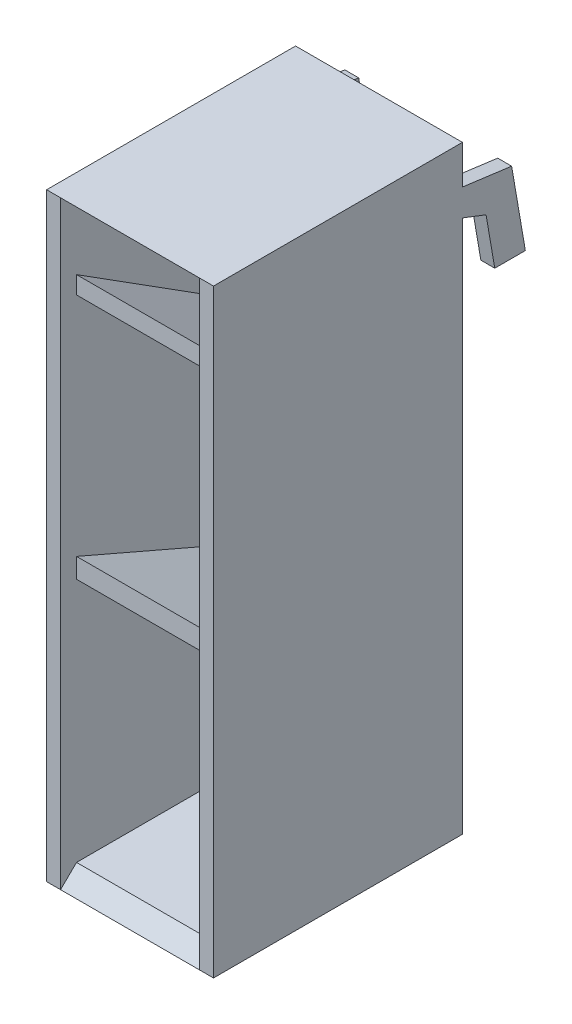
ISO-10303-21;
HEADER;
FILE_DESCRIPTION(('STEP AP214'),'2;1');
FILE_NAME('part.step','',(''),(''),'','','');
FILE_SCHEMA(('AUTOMOTIVE_DESIGN { 1 0 10303 214 1 1 1 1 }'));
ENDSEC;
DATA;
#1=APPLICATION_CONTEXT('core data for automotive mechanical design processes');
#2=APPLICATION_PROTOCOL_DEFINITION('international standard','automotive_design',2000,#1);
#3=PRODUCT_CONTEXT('',#1,'mechanical');
#4=PRODUCT('Part','Part','',(#3));
#5=PRODUCT_RELATED_PRODUCT_CATEGORY('part','',(#4));
#6=PRODUCT_DEFINITION_FORMATION('','',#4);
#7=PRODUCT_DEFINITION_CONTEXT('part definition',#1,'design');
#8=PRODUCT_DEFINITION('design','',#6,#7);
#9=PRODUCT_DEFINITION_SHAPE('','',#8);
#10=(LENGTH_UNIT() NAMED_UNIT(*) SI_UNIT(.MILLI.,.METRE.));
#11=(NAMED_UNIT(*) PLANE_ANGLE_UNIT() SI_UNIT($,.RADIAN.));
#12=(NAMED_UNIT(*) SI_UNIT($,.STERADIAN.) SOLID_ANGLE_UNIT());
#13=UNCERTAINTY_MEASURE_WITH_UNIT(LENGTH_MEASURE(1.E-05),#10,'distance_accuracy_value','');
#14=(GEOMETRIC_REPRESENTATION_CONTEXT(3) GLOBAL_UNCERTAINTY_ASSIGNED_CONTEXT((#13)) GLOBAL_UNIT_ASSIGNED_CONTEXT((#10,
#11,#12)) REPRESENTATION_CONTEXT('',''));
#15=CARTESIAN_POINT('',(0.,0.,0.));
#16=DIRECTION('',(0.,0.,1.));
#17=DIRECTION('',(1.,0.,0.));
#18=AXIS2_PLACEMENT_3D('',#15,#16,#17);
#19=CARTESIAN_POINT('',(10.,-4.46117209051456,-4.35352786609305));
#20=DIRECTION('',(0.,0.715688534191547,0.69841958880515));
#21=DIRECTION('',(0.,-0.69841958880515,0.715688534191547));
#22=AXIS2_PLACEMENT_3D('',#19,#20,#21);
#23=PLANE('',#22);
#24=DIRECTION('',(0.,0.69841958880515,-0.715688534191547));
#25=VECTOR('',#24,1.);
#26=CARTESIAN_POINT('',(0.,-4.46117209051456,-4.35352786609305));
#27=LINE('',#26,#25);
#28=CARTESIAN_POINT('',(0.,-45.8518823573684,38.0605985914855));
#29=VERTEX_POINT('',#28);
#30=CARTESIAN_POINT('',(0.,-43.6046392851225,35.7577907577315));
#31=VERTEX_POINT('',#30);
#32=EDGE_CURVE('E441',#29,#31,#27,.T.);
#33=ORIENTED_EDGE('',*,*,#32,.F.);
#34=DIRECTION('',(-1.,0.,0.));
#35=VECTOR('',#34,1.);
#36=CARTESIAN_POINT('',(10.,-45.8518823573684,38.0605985914855));
#37=LINE('',#36,#35);
#38=CARTESIAN_POINT('',(20.,-45.8518823573684,38.0605985914855));
#39=VERTEX_POINT('',#38);
#40=EDGE_CURVE('E11',#39,#29,#37,.T.);
#41=ORIENTED_EDGE('',*,*,#40,.F.);
#42=DIRECTION('',(0.,0.69841958880515,-0.715688534191547));
#43=VECTOR('',#42,1.);
#44=CARTESIAN_POINT('',(20.,-4.46117209051456,-4.35352786609305));
#45=LINE('',#44,#43);
#46=CARTESIAN_POINT('',(20.,-43.6046392851225,35.7577907577315));
#47=VERTEX_POINT('',#46);
#48=EDGE_CURVE('E321',#39,#47,#45,.T.);
#49=ORIENTED_EDGE('',*,*,#48,.T.);
#50=DIRECTION('',(-1.,0.,0.));
#51=VECTOR('',#50,1.);
#52=CARTESIAN_POINT('',(10.,-43.6046392851225,35.7577907577315));
#53=LINE('',#52,#51);
#54=EDGE_CURVE('E515',#47,#31,#53,.T.);
#55=ORIENTED_EDGE('',*,*,#54,.T.);
#56=EDGE_LOOP('',(#33,#41,#49,#55));
#57=FACE_BOUND('',#56,.T.);
#58=ADVANCED_FACE('F41',(#57),#23,.T.);
#59=CARTESIAN_POINT('',(10.,-45.8518823573684,0.));
#60=DIRECTION('',(0.,-1.,0.));
#61=DIRECTION('',(0.,0.,-1.));
#62=AXIS2_PLACEMENT_3D('',#59,#60,#61);
#63=PLANE('',#62);
#64=ORIENTED_EDGE('',*,*,#40,.T.);
#65=DIRECTION('',(1.,0.,0.));
#66=VECTOR('',#65,1.);
#67=CARTESIAN_POINT('',(-2.,-45.8518823573684,38.0605985914855));
#68=LINE('',#67,#66);
#69=CARTESIAN_POINT('',(-2.,-45.8518823573684,38.0605985914855));
#70=VERTEX_POINT('',#69);
#71=EDGE_CURVE('E461',#70,#29,#68,.T.);
#72=ORIENTED_EDGE('',*,*,#71,.F.);
#73=DIRECTION('',(0.,0.,1.));
#74=VECTOR('',#73,1.);
#75=CARTESIAN_POINT('',(-2.,-45.8518823573684,0.));
#76=LINE('',#75,#74);
#77=CARTESIAN_POINT('',(-2.,-45.8518823573684,2.25526100625473));
#78=VERTEX_POINT('',#77);
#79=EDGE_CURVE('E399',#78,#70,#76,.T.);
#80=ORIENTED_EDGE('',*,*,#79,.F.);
#81=DIRECTION('',(-1.,0.,0.));
#82=VECTOR('',#81,1.);
#83=CARTESIAN_POINT('',(10.,-45.8518823573684,2.25526100625473));
#84=LINE('',#83,#82);
#85=CARTESIAN_POINT('',(22.,-45.8518823573684,2.25526100625473));
#86=VERTEX_POINT('',#85);
#87=EDGE_CURVE('E49',#86,#78,#84,.T.);
#88=ORIENTED_EDGE('',*,*,#87,.F.);
#89=DIRECTION('',(0.,0.,1.));
#90=VECTOR('',#89,1.);
#91=CARTESIAN_POINT('',(22.,-45.8518823573684,0.));
#92=LINE('',#91,#90);
#93=CARTESIAN_POINT('',(22.,-45.8518823573684,38.0605985914855));
#94=VERTEX_POINT('',#93);
#95=EDGE_CURVE('E274',#86,#94,#92,.T.);
#96=ORIENTED_EDGE('',*,*,#95,.T.);
#97=DIRECTION('',(-1.,0.,0.));
#98=VECTOR('',#97,1.);
#99=CARTESIAN_POINT('',(22.,-45.8518823573684,38.0605985914855));
#100=LINE('',#99,#98);
#101=EDGE_CURVE('E322',#94,#39,#100,.T.);
#102=ORIENTED_EDGE('',*,*,#101,.T.);
#103=EDGE_LOOP('',(#64,#72,#80,#88,#96,#102));
#104=FACE_BOUND('',#103,.T.);
#105=ADVANCED_FACE('F564',(#104),#63,.T.);
#106=CARTESIAN_POINT('',(10.,0.,2.25526100625473));
#107=DIRECTION('',(0.,0.,-1.));
#108=DIRECTION('',(-1.,0.,0.));
#109=AXIS2_PLACEMENT_3D('',#106,#107,#108);
#110=PLANE('',#109);
#111=DIRECTION('',(0.,-1.,0.));
#112=VECTOR('',#111,1.);
#113=CARTESIAN_POINT('',(0.,0.,2.25526100625473));
#114=LINE('',#113,#112);
#115=CARTESIAN_POINT('',(0.,34.7722301495068,2.25526100625473));
#116=VERTEX_POINT('',#115);
#117=CARTESIAN_POINT('',(0.,30.9242783924333,2.25526100625473));
#118=VERTEX_POINT('',#117);
#119=EDGE_CURVE('E56',#116,#118,#114,.T.);
#120=ORIENTED_EDGE('',*,*,#119,.F.);
#121=DIRECTION('',(1.,0.,0.));
#122=VECTOR('',#121,1.);
#123=CARTESIAN_POINT('',(-2.,34.7722301495068,2.25526100625473));
#124=LINE('',#123,#122);
#125=CARTESIAN_POINT('',(-2.,34.7722301495068,2.25526100625473));
#126=VERTEX_POINT('',#125);
#127=EDGE_CURVE('E438',#126,#116,#124,.T.);
#128=ORIENTED_EDGE('',*,*,#127,.F.);
#129=DIRECTION('',(0.,-1.,0.));
#130=VECTOR('',#129,1.);
#131=CARTESIAN_POINT('',(-2.,0.,2.25526100625473));
#132=LINE('',#131,#130);
#133=CARTESIAN_POINT('',(-2.,40.3411719069311,2.25526100625473));
#134=VERTEX_POINT('',#133);
#135=EDGE_CURVE('E243',#134,#126,#132,.T.);
#136=ORIENTED_EDGE('',*,*,#135,.F.);
#137=DIRECTION('',(-1.,0.,0.));
#138=VECTOR('',#137,1.);
#139=CARTESIAN_POINT('',(10.,40.3411719069311,2.25526100625473));
#140=LINE('',#139,#138);
#141=CARTESIAN_POINT('',(22.,40.3411719069311,2.25526100625473));
#142=VERTEX_POINT('',#141);
#143=EDGE_CURVE('E237',#142,#134,#140,.T.);
#144=ORIENTED_EDGE('',*,*,#143,.F.);
#145=DIRECTION('',(0.,-1.,0.));
#146=VECTOR('',#145,1.);
#147=CARTESIAN_POINT('',(22.,0.,2.25526100625473));
#148=LINE('',#147,#146);
#149=CARTESIAN_POINT('',(22.,34.7722301495068,2.25526100625473));
#150=VERTEX_POINT('',#149);
#151=EDGE_CURVE('E242',#142,#150,#148,.T.);
#152=ORIENTED_EDGE('',*,*,#151,.T.);
#153=DIRECTION('',(-1.,0.,0.));
#154=VECTOR('',#153,1.);
#155=CARTESIAN_POINT('',(22.,34.7722301495068,2.25526100625473));
#156=LINE('',#155,#154);
#157=CARTESIAN_POINT('',(20.,34.7722301495068,2.25526100625473));
#158=VERTEX_POINT('',#157);
#159=EDGE_CURVE('E295',#150,#158,#156,.T.);
#160=ORIENTED_EDGE('',*,*,#159,.T.);
#161=DIRECTION('',(0.,-1.,0.));
#162=VECTOR('',#161,1.);
#163=CARTESIAN_POINT('',(20.,0.,2.25526100625473));
#164=LINE('',#163,#162);
#165=CARTESIAN_POINT('',(20.,30.9242783924333,2.25526100625473));
#166=VERTEX_POINT('',#165);
#167=EDGE_CURVE('E386',#158,#166,#164,.T.);
#168=ORIENTED_EDGE('',*,*,#167,.T.);
#169=DIRECTION('',(-1.,0.,0.));
#170=VECTOR('',#169,1.);
#171=CARTESIAN_POINT('',(22.,30.9242783924333,2.25526100625473));
#172=LINE('',#171,#170);
#173=CARTESIAN_POINT('',(22.,30.9242783924333,2.25526100625473));
#174=VERTEX_POINT('',#173);
#175=EDGE_CURVE('E326',#174,#166,#172,.T.);
#176=ORIENTED_EDGE('',*,*,#175,.F.);
#177=EDGE_CURVE('E268',#174,#86,#148,.T.);
#178=ORIENTED_EDGE('',*,*,#177,.T.);
#179=ORIENTED_EDGE('',*,*,#87,.T.);
#180=CARTESIAN_POINT('',(-2.,30.9242783924333,2.25526100625473));
#181=VERTEX_POINT('',#180);
#182=EDGE_CURVE('E402',#181,#78,#132,.T.);
#183=ORIENTED_EDGE('',*,*,#182,.F.);
#184=DIRECTION('',(1.,0.,0.));
#185=VECTOR('',#184,1.);
#186=CARTESIAN_POINT('',(-2.,30.9242783924333,2.25526100625473));
#187=LINE('',#186,#185);
#188=EDGE_CURVE('E458',#181,#118,#187,.T.);
#189=ORIENTED_EDGE('',*,*,#188,.T.);
#190=EDGE_LOOP('',(#120,#128,#136,#144,#152,#160,#168,#176,#178,#179,#183,#189));
#191=FACE_BOUND('',#190,.T.);
#192=ADVANCED_FACE('F239',(#191),#110,.T.);
#193=CARTESIAN_POINT('',(10.,40.3411719069311,0.));
#194=DIRECTION('',(0.,-1.,0.));
#195=DIRECTION('',(0.,0.,-1.));
#196=AXIS2_PLACEMENT_3D('',#193,#194,#195);
#197=PLANE('',#196);
#198=ORIENTED_EDGE('',*,*,#143,.T.);
#199=DIRECTION('',(0.,0.,1.));
#200=VECTOR('',#199,1.);
#201=CARTESIAN_POINT('',(-2.,40.3411719069311,0.));
#202=LINE('',#201,#200);
#203=CARTESIAN_POINT('',(-2.,40.3411719069311,38.0605985914855));
#204=VERTEX_POINT('',#203);
#205=EDGE_CURVE('E391',#134,#204,#202,.T.);
#206=ORIENTED_EDGE('',*,*,#205,.T.);
#207=DIRECTION('',(1.,0.,0.));
#208=VECTOR('',#207,1.);
#209=CARTESIAN_POINT('',(-2.,40.3411719069311,38.0605985914855));
#210=LINE('',#209,#208);
#211=CARTESIAN_POINT('',(0.,40.3411719069311,38.0605985914855));
#212=VERTEX_POINT('',#211);
#213=EDGE_CURVE('E465',#204,#212,#210,.T.);
#214=ORIENTED_EDGE('',*,*,#213,.T.);
#215=DIRECTION('',(-1.,0.,0.));
#216=VECTOR('',#215,1.);
#217=CARTESIAN_POINT('',(10.,40.3411719069311,38.0605985914855));
#218=LINE('',#217,#216);
#219=CARTESIAN_POINT('',(20.,40.3411719069311,38.0605985914855));
#220=VERTEX_POINT('',#219);
#221=EDGE_CURVE('E248',#220,#212,#218,.T.);
#222=ORIENTED_EDGE('',*,*,#221,.F.);
#223=DIRECTION('',(-1.,0.,0.));
#224=VECTOR('',#223,1.);
#225=CARTESIAN_POINT('',(22.,40.3411719069311,38.0605985914855));
#226=LINE('',#225,#224);
#227=CARTESIAN_POINT('',(22.,40.3411719069311,38.0605985914855));
#228=VERTEX_POINT('',#227);
#229=EDGE_CURVE('E256',#228,#220,#226,.T.);
#230=ORIENTED_EDGE('',*,*,#229,.F.);
#231=DIRECTION('',(0.,0.,1.));
#232=VECTOR('',#231,1.);
#233=CARTESIAN_POINT('',(22.,40.3411719069311,0.));
#234=LINE('',#233,#232);
#235=EDGE_CURVE('E252',#142,#228,#234,.T.);
#236=ORIENTED_EDGE('',*,*,#235,.F.);
#237=EDGE_LOOP('',(#198,#206,#214,#222,#230,#236));
#238=FACE_BOUND('',#237,.T.);
#239=ADVANCED_FACE('F253',(#238),#197,.F.);
#240=CARTESIAN_POINT('',(10.,14.1986513185064,-8.04996705648252));
#241=DIRECTION('',(0.,-0.869915348375173,0.493201061091013));
#242=DIRECTION('',(0.,-0.493201061091013,-0.869915348375173));
#243=AXIS2_PLACEMENT_3D('',#240,#241,#242);
#244=PLANE('',#243);
#245=DIRECTION('',(0.,0.493201061091013,0.869915348375173));
#246=VECTOR('',#245,1.);
#247=CARTESIAN_POINT('',(0.,14.1986513185064,-8.04996705648252));
#248=LINE('',#247,#246);
#249=CARTESIAN_POINT('',(0.,39.0355882438568,35.7577907577315));
#250=VERTEX_POINT('',#249);
#251=EDGE_CURVE('E474',#250,#212,#248,.T.);
#252=ORIENTED_EDGE('',*,*,#251,.F.);
#253=DIRECTION('',(-1.,0.,0.));
#254=VECTOR('',#253,1.);
#255=CARTESIAN_POINT('',(10.,39.0355882438568,35.7577907577315));
#256=LINE('',#255,#254);
#257=CARTESIAN_POINT('',(20.,39.0355882438568,35.7577907577315));
#258=VERTEX_POINT('',#257);
#259=EDGE_CURVE('E549',#258,#250,#256,.T.);
#260=ORIENTED_EDGE('',*,*,#259,.F.);
#261=DIRECTION('',(0.,0.493201061091013,0.869915348375173));
#262=VECTOR('',#261,1.);
#263=CARTESIAN_POINT('',(20.,14.1986513185064,-8.04996705648252));
#264=LINE('',#263,#262);
#265=EDGE_CURVE('E382',#258,#220,#264,.T.);
#266=ORIENTED_EDGE('',*,*,#265,.T.);
#267=ORIENTED_EDGE('',*,*,#221,.T.);
#268=EDGE_LOOP('',(#252,#260,#266,#267));
#269=FACE_BOUND('',#268,.T.);
#270=ADVANCED_FACE('F577',(#269),#244,.T.);
#271=CARTESIAN_POINT('',(10.,39.0355882438568,0.));
#272=DIRECTION('',(0.,1.,0.));
#273=DIRECTION('',(0.,0.,1.));
#274=AXIS2_PLACEMENT_3D('',#271,#272,#273);
#275=PLANE('',#274);
#276=DIRECTION('',(0.,0.,-1.));
#277=VECTOR('',#276,1.);
#278=CARTESIAN_POINT('',(0.,39.0355882438568,0.));
#279=LINE('',#278,#277);
#280=CARTESIAN_POINT('',(0.,39.0355882438568,3.77443346887169));
#281=VERTEX_POINT('',#280);
#282=EDGE_CURVE('E478',#250,#281,#279,.T.);
#283=ORIENTED_EDGE('',*,*,#282,.T.);
#284=DIRECTION('',(-1.,0.,0.));
#285=VECTOR('',#284,1.);
#286=CARTESIAN_POINT('',(10.,39.0355882438568,3.77443346887169));
#287=LINE('',#286,#285);
#288=CARTESIAN_POINT('',(20.,39.0355882438568,3.77443346887169));
#289=VERTEX_POINT('',#288);
#290=EDGE_CURVE('E545',#289,#281,#287,.T.);
#291=ORIENTED_EDGE('',*,*,#290,.F.);
#292=DIRECTION('',(0.,0.,-1.));
#293=VECTOR('',#292,1.);
#294=CARTESIAN_POINT('',(20.,39.0355882438568,0.));
#295=LINE('',#294,#293);
#296=EDGE_CURVE('E379',#258,#289,#295,.T.);
#297=ORIENTED_EDGE('',*,*,#296,.F.);
#298=ORIENTED_EDGE('',*,*,#259,.T.);
#299=EDGE_LOOP('',(#283,#291,#297,#298));
#300=FACE_BOUND('',#299,.T.);
#301=ADVANCED_FACE('F676',(#300),#275,.F.);
#302=CARTESIAN_POINT('',(10.,0.,3.77443346887169));
#303=DIRECTION('',(0.,0.,-1.));
#304=DIRECTION('',(-1.,0.,0.));
#305=AXIS2_PLACEMENT_3D('',#302,#303,#304);
#306=PLANE('',#305);
#307=DIRECTION('',(0.,-1.,0.));
#308=VECTOR('',#307,1.);
#309=CARTESIAN_POINT('',(0.,0.,3.77443346887169));
#310=LINE('',#309,#308);
#311=CARTESIAN_POINT('',(0.,9.35803521468779,3.77443346887169));
#312=VERTEX_POINT('',#311);
#313=EDGE_CURVE('E481',#281,#312,#310,.T.);
#314=ORIENTED_EDGE('',*,*,#313,.T.);
#315=DIRECTION('',(-1.,0.,0.));
#316=VECTOR('',#315,1.);
#317=CARTESIAN_POINT('',(10.,9.35803521468779,3.77443346887169));
#318=LINE('',#317,#316);
#319=CARTESIAN_POINT('',(20.,9.35803521468779,3.77443346887169));
#320=VERTEX_POINT('',#319);
#321=EDGE_CURVE('E542',#320,#312,#318,.T.);
#322=ORIENTED_EDGE('',*,*,#321,.F.);
#323=DIRECTION('',(0.,-1.,0.));
#324=VECTOR('',#323,1.);
#325=CARTESIAN_POINT('',(20.,0.,3.77443346887169));
#326=LINE('',#325,#324);
#327=EDGE_CURVE('E354',#289,#320,#326,.T.);
#328=ORIENTED_EDGE('',*,*,#327,.F.);
#329=ORIENTED_EDGE('',*,*,#290,.T.);
#330=EDGE_LOOP('',(#314,#322,#328,#329));
#331=FACE_BOUND('',#330,.T.);
#332=ADVANCED_FACE('F652',(#331),#306,.F.);
#333=CARTESIAN_POINT('',(10.,4.97276127003305,-3.14949920287875));
#334=DIRECTION('',(0.,0.844812645458888,-0.535062233831501));
#335=DIRECTION('',(0.,0.535062233831501,0.844812645458888));
#336=AXIS2_PLACEMENT_3D('',#333,#334,#335);
#337=PLANE('',#336);
#338=DIRECTION('',(0.,-0.535062233831501,-0.844812645458887));
#339=VECTOR('',#338,1.);
#340=CARTESIAN_POINT('',(0.,4.97276127003305,-3.14949920287875));
#341=LINE('',#340,#339);
#342=CARTESIAN_POINT('',(0.,29.6147000366411,35.7577907577315));
#343=VERTEX_POINT('',#342);
#344=EDGE_CURVE('E485',#343,#312,#341,.T.);
#345=ORIENTED_EDGE('',*,*,#344,.F.);
#346=DIRECTION('',(-1.,0.,0.));
#347=VECTOR('',#346,1.);
#348=CARTESIAN_POINT('',(10.,29.6147000366411,35.7577907577315));
#349=LINE('',#348,#347);
#350=CARTESIAN_POINT('',(20.,29.6147000366411,35.7577907577315));
#351=VERTEX_POINT('',#350);
#352=EDGE_CURVE('E539',#351,#343,#349,.T.);
#353=ORIENTED_EDGE('',*,*,#352,.F.);
#354=DIRECTION('',(0.,-0.535062233831501,-0.844812645458887));
#355=VECTOR('',#354,1.);
#356=CARTESIAN_POINT('',(20.,4.97276127003305,-3.14949920287875));
#357=LINE('',#356,#355);
#358=EDGE_CURVE('E375',#351,#320,#357,.T.);
#359=ORIENTED_EDGE('',*,*,#358,.T.);
#360=ORIENTED_EDGE('',*,*,#321,.T.);
#361=EDGE_LOOP('',(#345,#353,#359,#360));
#362=FACE_BOUND('',#361,.T.);
#363=ADVANCED_FACE('F655',(#362),#337,.T.);
#364=CARTESIAN_POINT('',(10.,0.,35.7577907577315));
#365=DIRECTION('',(0.,0.,1.));
#366=DIRECTION('',(1.,0.,0.));
#367=AXIS2_PLACEMENT_3D('',#364,#365,#366);
#368=PLANE('',#367);
#369=DIRECTION('',(0.,1.,0.));
#370=VECTOR('',#369,1.);
#371=CARTESIAN_POINT('',(0.,0.,35.7577907577315));
#372=LINE('',#371,#370);
#373=CARTESIAN_POINT('',(0.,27.0807664130359,35.7577907577315));
#374=VERTEX_POINT('',#373);
#375=EDGE_CURVE('E491',#374,#343,#372,.T.);
#376=ORIENTED_EDGE('',*,*,#375,.F.);
#377=DIRECTION('',(-1.,0.,0.));
#378=VECTOR('',#377,1.);
#379=CARTESIAN_POINT('',(10.,27.0807664130359,35.7577907577315));
#380=LINE('',#379,#378);
#381=CARTESIAN_POINT('',(20.,27.0807664130359,35.7577907577315));
#382=VERTEX_POINT('',#381);
#383=EDGE_CURVE('E536',#382,#374,#380,.T.);
#384=ORIENTED_EDGE('',*,*,#383,.F.);
#385=DIRECTION('',(0.,1.,0.));
#386=VECTOR('',#385,1.);
#387=CARTESIAN_POINT('',(20.,0.,35.7577907577315));
#388=LINE('',#387,#386);
#389=EDGE_CURVE('E371',#382,#351,#388,.T.);
#390=ORIENTED_EDGE('',*,*,#389,.T.);
#391=ORIENTED_EDGE('',*,*,#352,.T.);
#392=EDGE_LOOP('',(#376,#384,#390,#391));
#393=FACE_BOUND('',#392,.T.);
#394=ADVANCED_FACE('F659',(#393),#368,.T.);
#395=CARTESIAN_POINT('',(10.,4.04477552627651,-2.43933072802459));
#396=DIRECTION('',(0.,-0.856326432689146,0.516434933634317));
#397=DIRECTION('',(0.,-0.516434933634317,-0.856326432689146));
#398=AXIS2_PLACEMENT_3D('',#395,#396,#397);
#399=PLANE('',#398);
#400=DIRECTION('',(0.,0.516434933634317,0.856326432689146));
#401=VECTOR('',#400,1.);
#402=CARTESIAN_POINT('',(0.,4.04477552627651,-2.43933072802459));
#403=LINE('',#402,#401);
#404=CARTESIAN_POINT('',(0.,7.79218396556303,3.77443346887169));
#405=VERTEX_POINT('',#404);
#406=EDGE_CURVE('E495',#405,#374,#403,.T.);
#407=ORIENTED_EDGE('',*,*,#406,.F.);
#408=DIRECTION('',(-1.,0.,0.));
#409=VECTOR('',#408,1.);
#410=CARTESIAN_POINT('',(10.,7.79218396556303,3.77443346887169));
#411=LINE('',#410,#409);
#412=CARTESIAN_POINT('',(20.,7.79218396556303,3.77443346887169));
#413=VERTEX_POINT('',#412);
#414=EDGE_CURVE('E533',#413,#405,#411,.T.);
#415=ORIENTED_EDGE('',*,*,#414,.F.);
#416=DIRECTION('',(0.,0.516434933634317,0.856326432689146));
#417=VECTOR('',#416,1.);
#418=CARTESIAN_POINT('',(20.,4.04477552627651,-2.43933072802459));
#419=LINE('',#418,#417);
#420=EDGE_CURVE('E367',#413,#382,#419,.T.);
#421=ORIENTED_EDGE('',*,*,#420,.T.);
#422=ORIENTED_EDGE('',*,*,#383,.T.);
#423=EDGE_LOOP('',(#407,#415,#421,#422));
#424=FACE_BOUND('',#423,.T.);
#425=ADVANCED_FACE('F661',(#424),#399,.T.);
#426=CARTESIAN_POINT('',(0.,-19.3260206973148,3.77443346887169));
#427=VERTEX_POINT('',#426);
#428=EDGE_CURVE('E487',#405,#427,#310,.T.);
#429=ORIENTED_EDGE('',*,*,#428,.T.);
#430=DIRECTION('',(-1.,0.,0.));
#431=VECTOR('',#430,1.);
#432=CARTESIAN_POINT('',(10.,-19.3260206973148,3.77443346887169));
#433=LINE('',#432,#431);
#434=CARTESIAN_POINT('',(20.,-19.3260206973148,3.77443346887169));
#435=VERTEX_POINT('',#434);
#436=EDGE_CURVE('E530',#435,#427,#433,.T.);
#437=ORIENTED_EDGE('',*,*,#436,.F.);
#438=EDGE_CURVE('E355',#413,#435,#326,.T.);
#439=ORIENTED_EDGE('',*,*,#438,.F.);
#440=ORIENTED_EDGE('',*,*,#414,.T.);
#441=EDGE_LOOP('',(#429,#437,#439,#440));
#442=FACE_BOUND('',#441,.T.);
#443=ADVANCED_FACE('F636',(#442),#306,.F.);
#444=CARTESIAN_POINT('',(10.,-17.6538079884003,7.63895639141563));
#445=DIRECTION('',(0.,0.917764639754874,-0.39712474868183));
#446=DIRECTION('',(0.,0.39712474868183,0.917764639754874));
#447=AXIS2_PLACEMENT_3D('',#444,#445,#446);
#448=PLANE('',#447);
#449=DIRECTION('',(0.,-0.39712474868183,-0.917764639754874));
#450=VECTOR('',#449,1.);
#451=CARTESIAN_POINT('',(0.,-17.6538079884003,7.63895639141563));
#452=LINE('',#451,#450);
#453=CARTESIAN_POINT('',(0.,-5.48654358613295,35.7577907577315));
#454=VERTEX_POINT('',#453);
#455=EDGE_CURVE('E499',#454,#427,#452,.T.);
#456=ORIENTED_EDGE('',*,*,#455,.F.);
#457=DIRECTION('',(-1.,0.,0.));
#458=VECTOR('',#457,1.);
#459=CARTESIAN_POINT('',(10.,-5.48654358613295,35.7577907577315));
#460=LINE('',#459,#458);
#461=CARTESIAN_POINT('',(20.,-5.48654358613295,35.7577907577315));
#462=VERTEX_POINT('',#461);
#463=EDGE_CURVE('E527',#462,#454,#460,.T.);
#464=ORIENTED_EDGE('',*,*,#463,.F.);
#465=DIRECTION('',(0.,-0.39712474868183,-0.917764639754874));
#466=VECTOR('',#465,1.);
#467=CARTESIAN_POINT('',(20.,-17.6538079884003,7.63895639141563));
#468=LINE('',#467,#466);
#469=EDGE_CURVE('E363',#462,#435,#468,.T.);
#470=ORIENTED_EDGE('',*,*,#469,.T.);
#471=ORIENTED_EDGE('',*,*,#436,.T.);
#472=EDGE_LOOP('',(#456,#464,#470,#471));
#473=FACE_BOUND('',#472,.T.);
#474=ADVANCED_FACE('F644',(#473),#448,.T.);
#475=CARTESIAN_POINT('',(10.,0.,35.7577907577315));
#476=DIRECTION('',(0.,0.,1.));
#477=DIRECTION('',(1.,0.,0.));
#478=AXIS2_PLACEMENT_3D('',#475,#476,#477);
#479=PLANE('',#478);
#480=DIRECTION('',(0.,1.,0.));
#481=VECTOR('',#480,1.);
#482=CARTESIAN_POINT('',(0.,0.,35.7577907577315));
#483=LINE('',#482,#481);
#484=CARTESIAN_POINT('',(0.,-8.33500587981462,35.7577907577315));
#485=VERTEX_POINT('',#484);
#486=EDGE_CURVE('E503',#485,#454,#483,.T.);
#487=ORIENTED_EDGE('',*,*,#486,.F.);
#488=DIRECTION('',(-1.,0.,0.));
#489=VECTOR('',#488,1.);
#490=CARTESIAN_POINT('',(10.,-8.33500587981462,35.7577907577315));
#491=LINE('',#490,#489);
#492=CARTESIAN_POINT('',(20.,-8.33500587981462,35.7577907577315));
#493=VERTEX_POINT('',#492);
#494=EDGE_CURVE('E524',#493,#485,#491,.T.);
#495=ORIENTED_EDGE('',*,*,#494,.F.);
#496=DIRECTION('',(0.,1.,0.));
#497=VECTOR('',#496,1.);
#498=CARTESIAN_POINT('',(20.,0.,35.7577907577315));
#499=LINE('',#498,#497);
#500=EDGE_CURVE('E359',#493,#462,#499,.T.);
#501=ORIENTED_EDGE('',*,*,#500,.T.);
#502=ORIENTED_EDGE('',*,*,#463,.T.);
#503=EDGE_LOOP('',(#487,#495,#501,#502));
#504=FACE_BOUND('',#503,.T.);
#505=ADVANCED_FACE('F736',(#504),#479,.T.);
#506=CARTESIAN_POINT('',(10.,-19.8040214649408,8.26004570029992));
#507=DIRECTION('',(0.,-0.922938374651154,0.384947732291394));
#508=DIRECTION('',(0.,-0.384947732291394,-0.922938374651154));
#509=AXIS2_PLACEMENT_3D('',#506,#507,#508);
#510=PLANE('',#509);
#511=DIRECTION('',(0.,0.384947732291394,0.922938374651154));
#512=VECTOR('',#511,1.);
#513=CARTESIAN_POINT('',(0.,-19.8040214649408,8.26004570029992));
#514=LINE('',#513,#512);
#515=CARTESIAN_POINT('',(0.,-21.6749223873123,3.77443346887169));
#516=VERTEX_POINT('',#515);
#517=EDGE_CURVE('E507',#516,#485,#514,.T.);
#518=ORIENTED_EDGE('',*,*,#517,.F.);
#519=DIRECTION('',(-1.,0.,0.));
#520=VECTOR('',#519,1.);
#521=CARTESIAN_POINT('',(10.,-21.6749223873123,3.77443346887169));
#522=LINE('',#521,#520);
#523=CARTESIAN_POINT('',(20.,-21.6749223873123,3.77443346887169));
#524=VERTEX_POINT('',#523);
#525=EDGE_CURVE('E521',#524,#516,#522,.T.);
#526=ORIENTED_EDGE('',*,*,#525,.F.);
#527=DIRECTION('',(0.,0.384947732291394,0.922938374651154));
#528=VECTOR('',#527,1.);
#529=CARTESIAN_POINT('',(20.,-19.8040214649408,8.26004570029992));
#530=LINE('',#529,#528);
#531=EDGE_CURVE('E353',#524,#493,#530,.T.);
#532=ORIENTED_EDGE('',*,*,#531,.T.);
#533=ORIENTED_EDGE('',*,*,#494,.T.);
#534=EDGE_LOOP('',(#518,#526,#532,#533));
#535=FACE_BOUND('',#534,.T.);
#536=ADVANCED_FACE('F745',(#535),#510,.T.);
#537=CARTESIAN_POINT('',(0.,-43.6046392851225,3.77443346887169));
#538=VERTEX_POINT('',#537);
#539=EDGE_CURVE('E486',#516,#538,#310,.T.);
#540=ORIENTED_EDGE('',*,*,#539,.T.);
#541=DIRECTION('',(-1.,0.,0.));
#542=VECTOR('',#541,1.);
#543=CARTESIAN_POINT('',(10.,-43.6046392851225,3.77443346887169));
#544=LINE('',#543,#542);
#545=CARTESIAN_POINT('',(20.,-43.6046392851225,3.77443346887169));
#546=VERTEX_POINT('',#545);
#547=EDGE_CURVE('E518',#546,#538,#544,.T.);
#548=ORIENTED_EDGE('',*,*,#547,.F.);
#549=EDGE_CURVE('E350',#524,#546,#326,.T.);
#550=ORIENTED_EDGE('',*,*,#549,.F.);
#551=ORIENTED_EDGE('',*,*,#525,.T.);
#552=EDGE_LOOP('',(#540,#548,#550,#551));
#553=FACE_BOUND('',#552,.T.);
#554=ADVANCED_FACE('F669',(#553),#306,.F.);
#555=CARTESIAN_POINT('',(10.,-43.6046392851225,0.));
#556=DIRECTION('',(0.,1.,0.));
#557=DIRECTION('',(0.,0.,1.));
#558=AXIS2_PLACEMENT_3D('',#555,#556,#557);
#559=PLANE('',#558);
#560=DIRECTION('',(0.,0.,-1.));
#561=VECTOR('',#560,1.);
#562=CARTESIAN_POINT('',(0.,-43.6046392851225,0.));
#563=LINE('',#562,#561);
#564=EDGE_CURVE('E511',#31,#538,#563,.T.);
#565=ORIENTED_EDGE('',*,*,#564,.F.);
#566=ORIENTED_EDGE('',*,*,#54,.F.);
#567=DIRECTION('',(0.,0.,-1.));
#568=VECTOR('',#567,1.);
#569=CARTESIAN_POINT('',(20.,-43.6046392851225,0.));
#570=LINE('',#569,#568);
#571=EDGE_CURVE('E346',#47,#546,#570,.T.);
#572=ORIENTED_EDGE('',*,*,#571,.T.);
#573=ORIENTED_EDGE('',*,*,#547,.T.);
#574=EDGE_LOOP('',(#565,#566,#572,#573));
#575=FACE_BOUND('',#574,.T.);
#576=ADVANCED_FACE('F624',(#575),#559,.T.);
#577=CARTESIAN_POINT('',(0.,0.,0.));
#578=DIRECTION('',(1.,0.,0.));
#579=DIRECTION('',(0.,0.,-1.));
#580=AXIS2_PLACEMENT_3D('',#577,#578,#579);
#581=PLANE('',#580);
#582=DIRECTION('',(0.,-1.,0.));
#583=VECTOR('',#582,1.);
#584=CARTESIAN_POINT('',(0.,0.,38.0605985914855));
#585=LINE('',#584,#583);
#586=EDGE_CURVE('E390',#212,#29,#585,.T.);
#587=ORIENTED_EDGE('',*,*,#586,.T.);
#588=ORIENTED_EDGE('',*,*,#32,.T.);
#589=ORIENTED_EDGE('',*,*,#564,.T.);
#590=ORIENTED_EDGE('',*,*,#539,.F.);
#591=ORIENTED_EDGE('',*,*,#517,.T.);
#592=ORIENTED_EDGE('',*,*,#486,.T.);
#593=ORIENTED_EDGE('',*,*,#455,.T.);
#594=ORIENTED_EDGE('',*,*,#428,.F.);
#595=ORIENTED_EDGE('',*,*,#406,.T.);
#596=ORIENTED_EDGE('',*,*,#375,.T.);
#597=ORIENTED_EDGE('',*,*,#344,.T.);
#598=ORIENTED_EDGE('',*,*,#313,.F.);
#599=ORIENTED_EDGE('',*,*,#282,.F.);
#600=ORIENTED_EDGE('',*,*,#251,.T.);
#601=EDGE_LOOP('',(#587,#588,#589,#590,#591,#592,#593,#594,#595,#596,#597,#598,#599,#600));
#602=FACE_BOUND('',#601,.T.);
#603=ADVANCED_FACE('F571',(#602),#581,.T.);
#604=CARTESIAN_POINT('',(-2.,33.8780872715528,-4.49050094817791));
#605=DIRECTION('',(0.,-0.991329487977844,0.131399567219935));
#606=DIRECTION('',(0.,-0.131399567219935,-0.991329487977844));
#607=AXIS2_PLACEMENT_3D('',#604,#605,#606);
#608=PLANE('',#607);
#609=DIRECTION('',(0.,-0.131399567219935,-0.991329487977844));
#610=VECTOR('',#609,1.);
#611=CARTESIAN_POINT('',(0.,33.8780872715528,-4.49050094817791));
#612=LINE('',#611,#610);
#613=CARTESIAN_POINT('',(0.,33.833827140775,-4.82441660490451));
#614=VERTEX_POINT('',#613);
#615=EDGE_CURVE('E395',#116,#614,#612,.T.);
#616=ORIENTED_EDGE('',*,*,#615,.T.);
#617=DIRECTION('',(1.,0.,0.));
#618=VECTOR('',#617,1.);
#619=CARTESIAN_POINT('',(-2.,33.833827140775,-4.82441660490451));
#620=LINE('',#619,#618);
#621=CARTESIAN_POINT('',(-2.,33.833827140775,-4.82441660490451));
#622=VERTEX_POINT('',#621);
#623=EDGE_CURVE('E442',#622,#614,#620,.T.);
#624=ORIENTED_EDGE('',*,*,#623,.F.);
#625=DIRECTION('',(0.,-0.131399567219935,-0.991329487977844));
#626=VECTOR('',#625,1.);
#627=CARTESIAN_POINT('',(-2.,33.8780872715528,-4.49050094817791));
#628=LINE('',#627,#626);
#629=EDGE_CURVE('E418',#126,#622,#628,.T.);
#630=ORIENTED_EDGE('',*,*,#629,.F.);
#631=ORIENTED_EDGE('',*,*,#127,.T.);
#632=EDGE_LOOP('',(#616,#624,#630,#631));
#633=FACE_BOUND('',#632,.T.);
#634=ADVANCED_FACE('F857',(#633),#608,.F.);
#635=CARTESIAN_POINT('',(-2.,1.77215889457269,-10.3265698971588));
#636=DIRECTION('',(0.,-0.169139027315505,0.985592202403593));
#637=DIRECTION('',(0.,-0.985592202403593,-0.169139027315505));
#638=AXIS2_PLACEMENT_3D('',#635,#636,#637);
#639=PLANE('',#638);
#640=DIRECTION('',(0.,-0.985592202403593,-0.169139027315505));
#641=VECTOR('',#640,1.);
#642=CARTESIAN_POINT('',(0.,1.77215889457269,-10.3265698971588));
#643=LINE('',#642,#641);
#644=CARTESIAN_POINT('',(0.,22.331937705566,-6.79827393313559));
#645=VERTEX_POINT('',#644);
#646=EDGE_CURVE('E433',#614,#645,#643,.T.);
#647=ORIENTED_EDGE('',*,*,#646,.T.);
#648=DIRECTION('',(1.,0.,0.));
#649=VECTOR('',#648,1.);
#650=CARTESIAN_POINT('',(-2.,22.331937705566,-6.79827393313559));
#651=LINE('',#650,#649);
#652=CARTESIAN_POINT('',(-2.,22.331937705566,-6.79827393313559));
#653=VERTEX_POINT('',#652);
#654=EDGE_CURVE('E446',#653,#645,#651,.T.);
#655=ORIENTED_EDGE('',*,*,#654,.F.);
#656=DIRECTION('',(0.,-0.985592202403593,-0.169139027315505));
#657=VECTOR('',#656,1.);
#658=CARTESIAN_POINT('',(-2.,1.77215889457269,-10.3265698971588));
#659=LINE('',#658,#657);
#660=EDGE_CURVE('E415',#622,#653,#659,.T.);
#661=ORIENTED_EDGE('',*,*,#660,.F.);
#662=ORIENTED_EDGE('',*,*,#623,.T.);
#663=EDGE_LOOP('',(#647,#655,#661,#662));
#664=FACE_BOUND('',#663,.T.);
#665=ADVANCED_FACE('F860',(#664),#639,.F.);
#666=CARTESIAN_POINT('',(-2.,22.331937705566,0.));
#667=DIRECTION('',(0.,1.,0.));
#668=DIRECTION('',(0.,0.,1.));
#669=AXIS2_PLACEMENT_3D('',#666,#667,#668);
#670=PLANE('',#669);
#671=DIRECTION('',(0.,0.,1.));
#672=VECTOR('',#671,1.);
#673=CARTESIAN_POINT('',(0.,22.331937705566,0.));
#674=LINE('',#673,#672);
#675=CARTESIAN_POINT('',(0.,22.331937705566,-2.39653984167632));
#676=VERTEX_POINT('',#675);
#677=EDGE_CURVE('E430',#645,#676,#674,.T.);
#678=ORIENTED_EDGE('',*,*,#677,.T.);
#679=DIRECTION('',(1.,0.,0.));
#680=VECTOR('',#679,1.);
#681=CARTESIAN_POINT('',(-2.,22.331937705566,-2.39653984167632));
#682=LINE('',#681,#680);
#683=CARTESIAN_POINT('',(-2.,22.331937705566,-2.39653984167632));
#684=VERTEX_POINT('',#683);
#685=EDGE_CURVE('E450',#684,#676,#682,.T.);
#686=ORIENTED_EDGE('',*,*,#685,.F.);
#687=DIRECTION('',(0.,0.,1.));
#688=VECTOR('',#687,1.);
#689=CARTESIAN_POINT('',(-2.,22.331937705566,0.));
#690=LINE('',#689,#688);
#691=EDGE_CURVE('E412',#653,#684,#690,.T.);
#692=ORIENTED_EDGE('',*,*,#691,.F.);
#693=ORIENTED_EDGE('',*,*,#654,.T.);
#694=EDGE_LOOP('',(#678,#686,#692,#693));
#695=FACE_BOUND('',#694,.T.);
#696=ADVANCED_FACE('F864',(#695),#670,.F.);
#697=CARTESIAN_POINT('',(-2.,1.03838054951878,-6.05076066107573));
#698=DIRECTION('',(0.,0.169139027315505,-0.985592202403593));
#699=DIRECTION('',(0.,0.985592202403593,0.169139027315505));
#700=AXIS2_PLACEMENT_3D('',#697,#698,#699);
#701=PLANE('',#700);
#702=DIRECTION('',(0.,0.985592202403593,0.169139027315505));
#703=VECTOR('',#702,1.);
#704=CARTESIAN_POINT('',(0.,1.03838054951878,-6.05076066107573));
#705=LINE('',#704,#703);
#706=CARTESIAN_POINT('',(0.,29.6147000366411,-1.14673354872471));
#707=VERTEX_POINT('',#706);
#708=EDGE_CURVE('E427',#676,#707,#705,.T.);
#709=ORIENTED_EDGE('',*,*,#708,.T.);
#710=DIRECTION('',(1.,0.,0.));
#711=VECTOR('',#710,1.);
#712=CARTESIAN_POINT('',(-2.,29.6147000366411,-1.14673354872471));
#713=LINE('',#712,#711);
#714=CARTESIAN_POINT('',(-2.,29.6147000366411,-1.14673354872471));
#715=VERTEX_POINT('',#714);
#716=EDGE_CURVE('E454',#715,#707,#713,.T.);
#717=ORIENTED_EDGE('',*,*,#716,.F.);
#718=DIRECTION('',(0.,0.985592202403593,0.169139027315505));
#719=VECTOR('',#718,1.);
#720=CARTESIAN_POINT('',(-2.,1.03838054951878,-6.05076066107573));
#721=LINE('',#720,#719);
#722=EDGE_CURVE('E409',#684,#715,#721,.T.);
#723=ORIENTED_EDGE('',*,*,#722,.F.);
#724=ORIENTED_EDGE('',*,*,#685,.T.);
#725=EDGE_LOOP('',(#709,#717,#723,#724));
#726=FACE_BOUND('',#725,.T.);
#727=ADVANCED_FACE('F868',(#726),#701,.F.);
#728=CARTESIAN_POINT('',(-2.,26.1771443117733,-10.0767420562066));
#729=DIRECTION('',(0.,0.933242726404761,-0.359246452470456));
#730=DIRECTION('',(0.,0.359246452470456,0.933242726404761));
#731=AXIS2_PLACEMENT_3D('',#728,#729,#730);
#732=PLANE('',#731);
#733=DIRECTION('',(0.,0.359246452470456,0.933242726404761));
#734=VECTOR('',#733,1.);
#735=CARTESIAN_POINT('',(0.,26.1771443117733,-10.0767420562066));
#736=LINE('',#735,#734);
#737=EDGE_CURVE('E424',#707,#118,#736,.T.);
#738=ORIENTED_EDGE('',*,*,#737,.T.);
#739=ORIENTED_EDGE('',*,*,#188,.F.);
#740=DIRECTION('',(0.,0.359246452470456,0.933242726404761));
#741=VECTOR('',#740,1.);
#742=CARTESIAN_POINT('',(-2.,26.1771443117733,-10.0767420562066));
#743=LINE('',#742,#741);
#744=EDGE_CURVE('E406',#715,#181,#743,.T.);
#745=ORIENTED_EDGE('',*,*,#744,.F.);
#746=ORIENTED_EDGE('',*,*,#716,.T.);
#747=EDGE_LOOP('',(#738,#739,#745,#746));
#748=FACE_BOUND('',#747,.T.);
#749=ADVANCED_FACE('F872',(#748),#732,.F.);
#750=CARTESIAN_POINT('',(-2.,0.,38.0605985914855));
#751=DIRECTION('',(0.,0.,1.));
#752=DIRECTION('',(1.,0.,0.));
#753=AXIS2_PLACEMENT_3D('',#750,#751,#752);
#754=PLANE('',#753);
#755=ORIENTED_EDGE('',*,*,#586,.F.);
#756=ORIENTED_EDGE('',*,*,#213,.F.);
#757=DIRECTION('',(0.,-1.,0.));
#758=VECTOR('',#757,1.);
#759=CARTESIAN_POINT('',(-2.,0.,38.0605985914855));
#760=LINE('',#759,#758);
#761=EDGE_CURVE('E394',#204,#70,#760,.T.);
#762=ORIENTED_EDGE('',*,*,#761,.T.);
#763=ORIENTED_EDGE('',*,*,#71,.T.);
#764=EDGE_LOOP('',(#755,#756,#762,#763));
#765=FACE_BOUND('',#764,.T.);
#766=ADVANCED_FACE('F569',(#765),#754,.T.);
#767=CARTESIAN_POINT('',(-2.,0.,0.));
#768=DIRECTION('',(1.,0.,0.));
#769=DIRECTION('',(0.,0.,-1.));
#770=AXIS2_PLACEMENT_3D('',#767,#768,#769);
#771=PLANE('',#770);
#772=ORIENTED_EDGE('',*,*,#205,.F.);
#773=ORIENTED_EDGE('',*,*,#135,.T.);
#774=ORIENTED_EDGE('',*,*,#629,.T.);
#775=ORIENTED_EDGE('',*,*,#660,.T.);
#776=ORIENTED_EDGE('',*,*,#691,.T.);
#777=ORIENTED_EDGE('',*,*,#722,.T.);
#778=ORIENTED_EDGE('',*,*,#744,.T.);
#779=ORIENTED_EDGE('',*,*,#182,.T.);
#780=ORIENTED_EDGE('',*,*,#79,.T.);
#781=ORIENTED_EDGE('',*,*,#761,.F.);
#782=EDGE_LOOP('',(#772,#773,#774,#775,#776,#777,#778,#779,#780,#781));
#783=FACE_BOUND('',#782,.T.);
#784=ADVANCED_FACE('F559',(#783),#771,.F.);
#785=ORIENTED_EDGE('',*,*,#615,.F.);
#786=ORIENTED_EDGE('',*,*,#119,.T.);
#787=ORIENTED_EDGE('',*,*,#737,.F.);
#788=ORIENTED_EDGE('',*,*,#708,.F.);
#789=ORIENTED_EDGE('',*,*,#677,.F.);
#790=ORIENTED_EDGE('',*,*,#646,.F.);
#791=EDGE_LOOP('',(#785,#786,#787,#788,#789,#790));
#792=FACE_BOUND('',#791,.T.);
#793=ADVANCED_FACE('F784',(#792),#581,.T.);
#794=CARTESIAN_POINT('',(20.,0.,0.));
#795=DIRECTION('',(-1.,0.,0.));
#796=DIRECTION('',(0.,0.,-1.));
#797=AXIS2_PLACEMENT_3D('',#794,#795,#796);
#798=PLANE('',#797);
#799=ORIENTED_EDGE('',*,*,#167,.F.);
#800=DIRECTION('',(0.,-0.131399567219935,-0.991329487977844));
#801=VECTOR('',#800,1.);
#802=CARTESIAN_POINT('',(20.,33.8780872715528,-4.49050094817791));
#803=LINE('',#802,#801);
#804=CARTESIAN_POINT('',(20.,33.833827140775,-4.82441660490451));
#805=VERTEX_POINT('',#804);
#806=EDGE_CURVE('E296',#158,#805,#803,.T.);
#807=ORIENTED_EDGE('',*,*,#806,.T.);
#808=DIRECTION('',(0.,-0.985592202403593,-0.169139027315505));
#809=VECTOR('',#808,1.);
#810=CARTESIAN_POINT('',(20.,1.77215889457269,-10.3265698971588));
#811=LINE('',#810,#809);
#812=CARTESIAN_POINT('',(20.,22.331937705566,-6.79827393313559));
#813=VERTEX_POINT('',#812);
#814=EDGE_CURVE('E300',#805,#813,#811,.T.);
#815=ORIENTED_EDGE('',*,*,#814,.T.);
#816=DIRECTION('',(0.,0.,1.));
#817=VECTOR('',#816,1.);
#818=CARTESIAN_POINT('',(20.,22.331937705566,0.));
#819=LINE('',#818,#817);
#820=CARTESIAN_POINT('',(20.,22.331937705566,-2.39653984167632));
#821=VERTEX_POINT('',#820);
#822=EDGE_CURVE('E304',#813,#821,#819,.T.);
#823=ORIENTED_EDGE('',*,*,#822,.T.);
#824=DIRECTION('',(0.,0.985592202403593,0.169139027315505));
#825=VECTOR('',#824,1.);
#826=CARTESIAN_POINT('',(20.,1.03838054951878,-6.05076066107573));
#827=LINE('',#826,#825);
#828=CARTESIAN_POINT('',(20.,29.6147000366411,-1.14673354872471));
#829=VERTEX_POINT('',#828);
#830=EDGE_CURVE('E308',#821,#829,#827,.T.);
#831=ORIENTED_EDGE('',*,*,#830,.T.);
#832=DIRECTION('',(0.,0.359246452470456,0.933242726404761));
#833=VECTOR('',#832,1.);
#834=CARTESIAN_POINT('',(20.,26.1771443117733,-10.0767420562066));
#835=LINE('',#834,#833);
#836=EDGE_CURVE('E312',#829,#166,#835,.T.);
#837=ORIENTED_EDGE('',*,*,#836,.T.);
#838=EDGE_LOOP('',(#799,#807,#815,#823,#831,#837));
#839=FACE_BOUND('',#838,.T.);
#840=ADVANCED_FACE('F606',(#839),#798,.T.);
#841=ORIENTED_EDGE('',*,*,#48,.F.);
#842=DIRECTION('',(0.,-1.,0.));
#843=VECTOR('',#842,1.);
#844=CARTESIAN_POINT('',(20.,0.,38.0605985914855));
#845=LINE('',#844,#843);
#846=EDGE_CURVE('E259',#220,#39,#845,.T.);
#847=ORIENTED_EDGE('',*,*,#846,.F.);
#848=ORIENTED_EDGE('',*,*,#265,.F.);
#849=ORIENTED_EDGE('',*,*,#296,.T.);
#850=ORIENTED_EDGE('',*,*,#327,.T.);
#851=ORIENTED_EDGE('',*,*,#358,.F.);
#852=ORIENTED_EDGE('',*,*,#389,.F.);
#853=ORIENTED_EDGE('',*,*,#420,.F.);
#854=ORIENTED_EDGE('',*,*,#438,.T.);
#855=ORIENTED_EDGE('',*,*,#469,.F.);
#856=ORIENTED_EDGE('',*,*,#500,.F.);
#857=ORIENTED_EDGE('',*,*,#531,.F.);
#858=ORIENTED_EDGE('',*,*,#549,.T.);
#859=ORIENTED_EDGE('',*,*,#571,.F.);
#860=EDGE_LOOP('',(#841,#847,#848,#849,#850,#851,#852,#853,#854,#855,#856,#857,#858,#859));
#861=FACE_BOUND('',#860,.T.);
#862=ADVANCED_FACE('F580',(#861),#798,.T.);
#863=CARTESIAN_POINT('',(22.,0.,38.0605985914855));
#864=DIRECTION('',(0.,0.,-1.));
#865=DIRECTION('',(-1.,0.,0.));
#866=AXIS2_PLACEMENT_3D('',#863,#864,#865);
#867=PLANE('',#866);
#868=ORIENTED_EDGE('',*,*,#846,.T.);
#869=ORIENTED_EDGE('',*,*,#101,.F.);
#870=DIRECTION('',(0.,-1.,0.));
#871=VECTOR('',#870,1.);
#872=CARTESIAN_POINT('',(22.,0.,38.0605985914855));
#873=LINE('',#872,#871);
#874=EDGE_CURVE('E280',#228,#94,#873,.T.);
#875=ORIENTED_EDGE('',*,*,#874,.F.);
#876=ORIENTED_EDGE('',*,*,#229,.T.);
#877=EDGE_LOOP('',(#868,#869,#875,#876));
#878=FACE_BOUND('',#877,.T.);
#879=ADVANCED_FACE('F584',(#878),#867,.F.);
#880=CARTESIAN_POINT('',(22.,26.1771443117733,-10.0767420562066));
#881=DIRECTION('',(0.,-0.933242726404761,0.359246452470456));
#882=DIRECTION('',(0.,-0.359246452470456,-0.933242726404761));
#883=AXIS2_PLACEMENT_3D('',#880,#881,#882);
#884=PLANE('',#883);
#885=ORIENTED_EDGE('',*,*,#836,.F.);
#886=DIRECTION('',(-1.,0.,0.));
#887=VECTOR('',#886,1.);
#888=CARTESIAN_POINT('',(22.,29.6147000366411,-1.14673354872471));
#889=LINE('',#888,#887);
#890=CARTESIAN_POINT('',(22.,29.6147000366411,-1.14673354872471));
#891=VERTEX_POINT('',#890);
#892=EDGE_CURVE('E329',#891,#829,#889,.T.);
#893=ORIENTED_EDGE('',*,*,#892,.F.);
#894=DIRECTION('',(0.,0.359246452470456,0.933242726404761));
#895=VECTOR('',#894,1.);
#896=CARTESIAN_POINT('',(22.,26.1771443117733,-10.0767420562066));
#897=LINE('',#896,#895);
#898=EDGE_CURVE('E275',#891,#174,#897,.T.);
#899=ORIENTED_EDGE('',*,*,#898,.T.);
#900=ORIENTED_EDGE('',*,*,#175,.T.);
#901=EDGE_LOOP('',(#885,#893,#899,#900));
#902=FACE_BOUND('',#901,.T.);
#903=ADVANCED_FACE('F607',(#902),#884,.T.);
#904=CARTESIAN_POINT('',(22.,1.03838054951878,-6.05076066107573));
#905=DIRECTION('',(0.,-0.169139027315505,0.985592202403593));
#906=DIRECTION('',(0.,-0.985592202403593,-0.169139027315505));
#907=AXIS2_PLACEMENT_3D('',#904,#905,#906);
#908=PLANE('',#907);
#909=ORIENTED_EDGE('',*,*,#830,.F.);
#910=DIRECTION('',(-1.,0.,0.));
#911=VECTOR('',#910,1.);
#912=CARTESIAN_POINT('',(22.,22.331937705566,-2.39653984167632));
#913=LINE('',#912,#911);
#914=CARTESIAN_POINT('',(22.,22.331937705566,-2.39653984167632));
#915=VERTEX_POINT('',#914);
#916=EDGE_CURVE('E332',#915,#821,#913,.T.);
#917=ORIENTED_EDGE('',*,*,#916,.F.);
#918=DIRECTION('',(0.,0.985592202403593,0.169139027315505));
#919=VECTOR('',#918,1.);
#920=CARTESIAN_POINT('',(22.,1.03838054951878,-6.05076066107573));
#921=LINE('',#920,#919);
#922=EDGE_CURVE('E283',#915,#891,#921,.T.);
#923=ORIENTED_EDGE('',*,*,#922,.T.);
#924=ORIENTED_EDGE('',*,*,#892,.T.);
#925=EDGE_LOOP('',(#909,#917,#923,#924));
#926=FACE_BOUND('',#925,.T.);
#927=ADVANCED_FACE('F590',(#926),#908,.T.);
#928=CARTESIAN_POINT('',(22.,22.331937705566,0.));
#929=DIRECTION('',(0.,-1.,0.));
#930=DIRECTION('',(0.,0.,-1.));
#931=AXIS2_PLACEMENT_3D('',#928,#929,#930);
#932=PLANE('',#931);
#933=ORIENTED_EDGE('',*,*,#822,.F.);
#934=DIRECTION('',(-1.,0.,0.));
#935=VECTOR('',#934,1.);
#936=CARTESIAN_POINT('',(22.,22.331937705566,-6.79827393313559));
#937=LINE('',#936,#935);
#938=CARTESIAN_POINT('',(22.,22.331937705566,-6.79827393313559));
#939=VERTEX_POINT('',#938);
#940=EDGE_CURVE('E335',#939,#813,#937,.T.);
#941=ORIENTED_EDGE('',*,*,#940,.F.);
#942=DIRECTION('',(0.,0.,1.));
#943=VECTOR('',#942,1.);
#944=CARTESIAN_POINT('',(22.,22.331937705566,0.));
#945=LINE('',#944,#943);
#946=EDGE_CURVE('E289',#939,#915,#945,.T.);
#947=ORIENTED_EDGE('',*,*,#946,.T.);
#948=ORIENTED_EDGE('',*,*,#916,.T.);
#949=EDGE_LOOP('',(#933,#941,#947,#948));
#950=FACE_BOUND('',#949,.T.);
#951=ADVANCED_FACE('F594',(#950),#932,.T.);
#952=CARTESIAN_POINT('',(22.,1.77215889457269,-10.3265698971588));
#953=DIRECTION('',(0.,0.169139027315505,-0.985592202403593));
#954=DIRECTION('',(0.,0.985592202403593,0.169139027315505));
#955=AXIS2_PLACEMENT_3D('',#952,#953,#954);
#956=PLANE('',#955);
#957=ORIENTED_EDGE('',*,*,#814,.F.);
#958=DIRECTION('',(-1.,0.,0.));
#959=VECTOR('',#958,1.);
#960=CARTESIAN_POINT('',(22.,33.833827140775,-4.82441660490451));
#961=LINE('',#960,#959);
#962=CARTESIAN_POINT('',(22.,33.833827140775,-4.82441660490451));
#963=VERTEX_POINT('',#962);
#964=EDGE_CURVE('E338',#963,#805,#961,.T.);
#965=ORIENTED_EDGE('',*,*,#964,.F.);
#966=DIRECTION('',(0.,-0.985592202403593,-0.169139027315505));
#967=VECTOR('',#966,1.);
#968=CARTESIAN_POINT('',(22.,1.77215889457269,-10.3265698971588));
#969=LINE('',#968,#967);
#970=EDGE_CURVE('E270',#963,#939,#969,.T.);
#971=ORIENTED_EDGE('',*,*,#970,.T.);
#972=ORIENTED_EDGE('',*,*,#940,.T.);
#973=EDGE_LOOP('',(#957,#965,#971,#972));
#974=FACE_BOUND('',#973,.T.);
#975=ADVANCED_FACE('F601',(#974),#956,.T.);
#976=CARTESIAN_POINT('',(22.,33.8780872715528,-4.49050094817791));
#977=DIRECTION('',(0.,0.991329487977844,-0.131399567219935));
#978=DIRECTION('',(0.,0.131399567219935,0.991329487977844));
#979=AXIS2_PLACEMENT_3D('',#976,#977,#978);
#980=PLANE('',#979);
#981=ORIENTED_EDGE('',*,*,#806,.F.);
#982=ORIENTED_EDGE('',*,*,#159,.F.);
#983=DIRECTION('',(0.,-0.131399567219935,-0.991329487977844));
#984=VECTOR('',#983,1.);
#985=CARTESIAN_POINT('',(22.,33.8780872715528,-4.49050094817791));
#986=LINE('',#985,#984);
#987=EDGE_CURVE('E265',#150,#963,#986,.T.);
#988=ORIENTED_EDGE('',*,*,#987,.T.);
#989=ORIENTED_EDGE('',*,*,#964,.T.);
#990=EDGE_LOOP('',(#981,#982,#988,#989));
#991=FACE_BOUND('',#990,.T.);
#992=ADVANCED_FACE('F604',(#991),#980,.T.);
#993=CARTESIAN_POINT('',(22.,0.,0.));
#994=DIRECTION('',(-1.,0.,0.));
#995=DIRECTION('',(0.,0.,-1.));
#996=AXIS2_PLACEMENT_3D('',#993,#994,#995);
#997=PLANE('',#996);
#998=ORIENTED_EDGE('',*,*,#235,.T.);
#999=ORIENTED_EDGE('',*,*,#874,.T.);
#1000=ORIENTED_EDGE('',*,*,#95,.F.);
#1001=ORIENTED_EDGE('',*,*,#177,.F.);
#1002=ORIENTED_EDGE('',*,*,#898,.F.);
#1003=ORIENTED_EDGE('',*,*,#922,.F.);
#1004=ORIENTED_EDGE('',*,*,#946,.F.);
#1005=ORIENTED_EDGE('',*,*,#970,.F.);
#1006=ORIENTED_EDGE('',*,*,#987,.F.);
#1007=ORIENTED_EDGE('',*,*,#151,.F.);
#1008=EDGE_LOOP('',(#998,#999,#1000,#1001,#1002,#1003,#1004,#1005,#1006,#1007));
#1009=FACE_BOUND('',#1008,.T.);
#1010=ADVANCED_FACE('F262',(#1009),#997,.F.);
#1011=CLOSED_SHELL('',(#58,#105,#192,#239,#270,#301,#332,#363,#394,#425,#443,#474,#505,#536,
#554,#576,#603,#634,#665,#696,#727,#749,#766,#784,#793,#840,#862,#879,#903,#927,#951,#975,#992,#1010));
#1012=MANIFOLD_SOLID_BREP('B2',#1011);
#1013=ADVANCED_BREP_SHAPE_REPRESENTATION('',(#18,#1012),#14);
#1014=SHAPE_DEFINITION_REPRESENTATION(#9,#1013);
ENDSEC;
END-ISO-10303-21;
